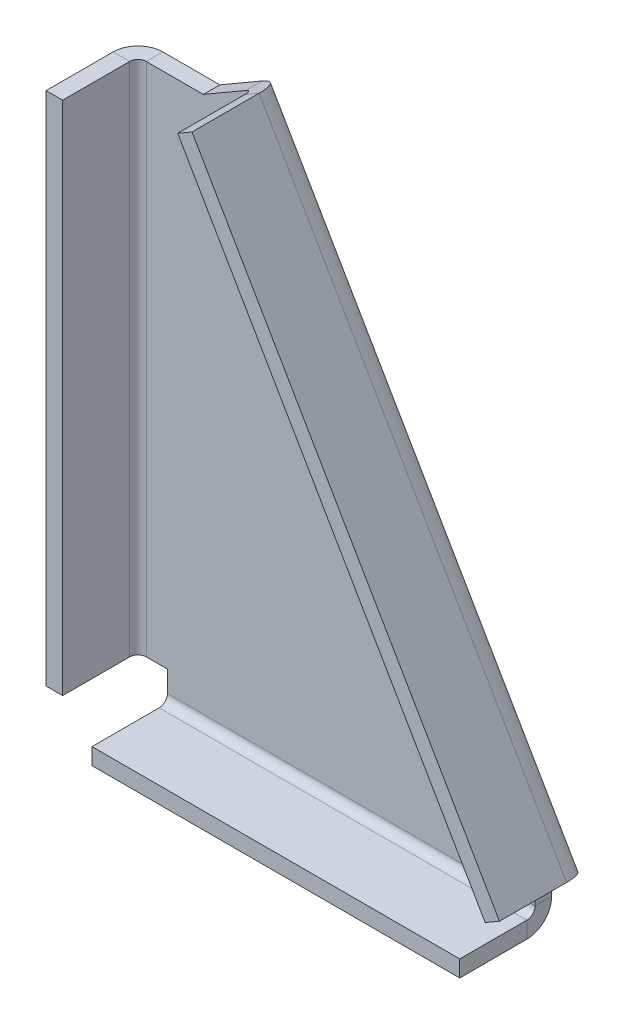
ISO-10303-21;
HEADER;
FILE_DESCRIPTION(('STEP AP214'),'2;1');
FILE_NAME('part.step','',(''),(''),'','','');
FILE_SCHEMA(('AUTOMOTIVE_DESIGN { 1 0 10303 214 1 1 1 1 }'));
ENDSEC;
DATA;
#1=APPLICATION_CONTEXT('core data for automotive mechanical design processes');
#2=APPLICATION_PROTOCOL_DEFINITION('international standard','automotive_design',2000,#1);
#3=PRODUCT_CONTEXT('',#1,'mechanical');
#4=PRODUCT('Part','Part','',(#3));
#5=PRODUCT_RELATED_PRODUCT_CATEGORY('part','',(#4));
#6=PRODUCT_DEFINITION_FORMATION('','',#4);
#7=PRODUCT_DEFINITION_CONTEXT('part definition',#1,'design');
#8=PRODUCT_DEFINITION('design','',#6,#7);
#9=PRODUCT_DEFINITION_SHAPE('','',#8);
#10=(LENGTH_UNIT() NAMED_UNIT(*) SI_UNIT(.MILLI.,.METRE.));
#11=(NAMED_UNIT(*) PLANE_ANGLE_UNIT() SI_UNIT($,.RADIAN.));
#12=(NAMED_UNIT(*) SI_UNIT($,.STERADIAN.) SOLID_ANGLE_UNIT());
#13=UNCERTAINTY_MEASURE_WITH_UNIT(LENGTH_MEASURE(1.E-05),#10,'distance_accuracy_value','');
#14=(GEOMETRIC_REPRESENTATION_CONTEXT(3) GLOBAL_UNCERTAINTY_ASSIGNED_CONTEXT((#13)) GLOBAL_UNIT_ASSIGNED_CONTEXT((#10,
#11,#12)) REPRESENTATION_CONTEXT('',''));
#15=CARTESIAN_POINT('',(0.,0.,0.));
#16=DIRECTION('',(0.,0.,1.));
#17=DIRECTION('',(1.,0.,0.));
#18=AXIS2_PLACEMENT_3D('',#15,#16,#17);
#19=CARTESIAN_POINT('',(0.,0.,-2.286));
#20=DIRECTION('',(0.,0.,-1.));
#21=DIRECTION('',(-1.,0.,0.));
#22=AXIS2_PLACEMENT_3D('',#19,#20,#21);
#23=PLANE('',#22);
#24=DIRECTION('',(-0.864865697453777,-0.502003312108388,0.));
#25=VECTOR('',#24,1.);
#26=CARTESIAN_POINT('',(13.8111595230831,76.3747536964412,-2.286));
#27=LINE('',#26,#25);
#28=CARTESIAN_POINT('',(10.8455350465142,74.6533843392215,-2.28599999999996));
#29=VERTEX_POINT('',#28);
#30=CARTESIAN_POINT('',(4.96439556786529,71.2397312067814,-2.286));
#31=VERTEX_POINT('',#30);
#32=EDGE_CURVE('E126',#29,#31,#27,.T.);
#33=ORIENTED_EDGE('',*,*,#32,.F.);
#34=DIRECTION('',(-0.502003312108388,0.864865697453777,0.));
#35=VECTOR('',#34,1.);
#36=CARTESIAN_POINT('',(10.8455350465142,74.6533843392216,-2.28599999999996));
#37=LINE('',#36,#35);
#38=CARTESIAN_POINT('',(53.326272702263,1.46635167466894,-2.286));
#39=VERTEX_POINT('',#38);
#40=EDGE_CURVE('E299',#29,#39,#37,.F.);
#41=ORIENTED_EDGE('',*,*,#40,.T.);
#42=DIRECTION('',(0.864865697453778,0.502003312108387,0.));
#43=VECTOR('',#42,1.);
#44=CARTESIAN_POINT('',(50.8,0.,-2.286));
#45=LINE('',#44,#43);
#46=CARTESIAN_POINT('',(50.8,0.,-2.286));
#47=VERTEX_POINT('',#46);
#48=EDGE_CURVE('E431',#47,#39,#45,.T.);
#49=ORIENTED_EDGE('',*,*,#48,.F.);
#50=DIRECTION('',(0.,1.,0.));
#51=VECTOR('',#50,1.);
#52=CARTESIAN_POINT('',(50.8,-6.35,-2.286));
#53=LINE('',#52,#51);
#54=CARTESIAN_POINT('',(50.8,-2.921,-2.286));
#55=VERTEX_POINT('',#54);
#56=EDGE_CURVE('E429',#55,#47,#53,.T.);
#57=ORIENTED_EDGE('',*,*,#56,.F.);
#58=DIRECTION('',(1.,0.,0.));
#59=VECTOR('',#58,1.);
#60=CARTESIAN_POINT('',(50.8,-2.921,-2.286));
#61=LINE('',#60,#59);
#62=CARTESIAN_POINT('',(0.,-2.92099999999999,-2.286));
#63=VERTEX_POINT('',#62);
#64=EDGE_CURVE('E352',#55,#63,#61,.F.);
#65=ORIENTED_EDGE('',*,*,#64,.T.);
#66=DIRECTION('',(0.,-1.,0.));
#67=VECTOR('',#66,1.);
#68=CARTESIAN_POINT('',(0.,0.,-2.286));
#69=LINE('',#68,#67);
#70=CARTESIAN_POINT('',(0.,0.,-2.286));
#71=VERTEX_POINT('',#70);
#72=EDGE_CURVE('E425',#71,#63,#69,.T.);
#73=ORIENTED_EDGE('',*,*,#72,.F.);
#74=DIRECTION('',(1.,0.,0.));
#75=VECTOR('',#74,1.);
#76=CARTESIAN_POINT('',(-6.35,0.,-2.286));
#77=LINE('',#76,#75);
#78=CARTESIAN_POINT('',(-2.92100000000002,0.,-2.28599999999999));
#79=VERTEX_POINT('',#78);
#80=EDGE_CURVE('E151',#79,#71,#77,.T.);
#81=ORIENTED_EDGE('',*,*,#80,.F.);
#82=DIRECTION('',(0.,-1.,0.));
#83=VECTOR('',#82,1.);
#84=CARTESIAN_POINT('',(-2.92100000000002,0.,-2.28599999999999));
#85=LINE('',#84,#83);
#86=CARTESIAN_POINT('',(-2.92100000000003,71.2397312067814,-2.286));
#87=VERTEX_POINT('',#86);
#88=EDGE_CURVE('E405',#79,#87,#85,.F.);
#89=ORIENTED_EDGE('',*,*,#88,.T.);
#90=DIRECTION('',(-1.,0.,0.));
#91=VECTOR('',#90,1.);
#92=CARTESIAN_POINT('',(4.96439556786529,71.2397312067814,-2.286));
#93=LINE('',#92,#91);
#94=EDGE_CURVE('E435',#31,#87,#93,.T.);
#95=ORIENTED_EDGE('',*,*,#94,.F.);
#96=EDGE_LOOP('',(#33,#41,#49,#57,#65,#73,#81,#89,#95));
#97=FACE_BOUND('',#96,.T.);
#98=ADVANCED_FACE('F101',(#97),#23,.T.);
#99=CARTESIAN_POINT('',(0.,0.,0.));
#100=DIRECTION('',(0.,0.,-1.));
#101=DIRECTION('',(-1.,0.,0.));
#102=AXIS2_PLACEMENT_3D('',#99,#100,#101);
#103=PLANE('',#102);
#104=DIRECTION('',(-0.502003312108388,0.864865697453777,0.));
#105=VECTOR('',#104,1.);
#106=CARTESIAN_POINT('',(10.8455350465141,74.6533843392216,0.));
#107=LINE('',#106,#105);
#108=CARTESIAN_POINT('',(10.8455350465142,74.6533843392215,0.));
#109=VERTEX_POINT('',#108);
#110=CARTESIAN_POINT('',(53.326272702263,1.46635167466892,0.));
#111=VERTEX_POINT('',#110);
#112=EDGE_CURVE('E312',#109,#111,#107,.F.);
#113=ORIENTED_EDGE('',*,*,#112,.F.);
#114=DIRECTION('',(-0.864865697453777,-0.502003312108388,0.));
#115=VECTOR('',#114,1.);
#116=CARTESIAN_POINT('',(13.8111595230831,76.3747536964412,0.));
#117=LINE('',#116,#115);
#118=CARTESIAN_POINT('',(4.96439556786529,71.2397312067814,0.));
#119=VERTEX_POINT('',#118);
#120=EDGE_CURVE('E145',#109,#119,#117,.T.);
#121=ORIENTED_EDGE('',*,*,#120,.T.);
#122=DIRECTION('',(-1.,0.,0.));
#123=VECTOR('',#122,1.);
#124=CARTESIAN_POINT('',(4.96439556786529,71.2397312067814,0.));
#125=LINE('',#124,#123);
#126=CARTESIAN_POINT('',(-2.92100000000003,71.2397312067814,0.));
#127=VERTEX_POINT('',#126);
#128=EDGE_CURVE('E426',#119,#127,#125,.T.);
#129=ORIENTED_EDGE('',*,*,#128,.T.);
#130=DIRECTION('',(0.,-1.,0.));
#131=VECTOR('',#130,1.);
#132=CARTESIAN_POINT('',(-2.921,0.,0.));
#133=LINE('',#132,#131);
#134=CARTESIAN_POINT('',(-2.921,0.,0.));
#135=VERTEX_POINT('',#134);
#136=EDGE_CURVE('E416',#135,#127,#133,.F.);
#137=ORIENTED_EDGE('',*,*,#136,.F.);
#138=DIRECTION('',(1.,0.,0.));
#139=VECTOR('',#138,1.);
#140=CARTESIAN_POINT('',(-6.35,0.,0.));
#141=LINE('',#140,#139);
#142=CARTESIAN_POINT('',(0.,0.,0.));
#143=VERTEX_POINT('',#142);
#144=EDGE_CURVE('E422',#135,#143,#141,.T.);
#145=ORIENTED_EDGE('',*,*,#144,.T.);
#146=DIRECTION('',(0.,-1.,0.));
#147=VECTOR('',#146,1.);
#148=CARTESIAN_POINT('',(0.,0.,0.));
#149=LINE('',#148,#147);
#150=CARTESIAN_POINT('',(0.,-2.921,0.));
#151=VERTEX_POINT('',#150);
#152=EDGE_CURVE('E439',#143,#151,#149,.T.);
#153=ORIENTED_EDGE('',*,*,#152,.T.);
#154=DIRECTION('',(1.,0.,0.));
#155=VECTOR('',#154,1.);
#156=CARTESIAN_POINT('',(50.8,-2.921,0.));
#157=LINE('',#156,#155);
#158=CARTESIAN_POINT('',(50.8,-2.921,0.));
#159=VERTEX_POINT('',#158);
#160=EDGE_CURVE('E365',#159,#151,#157,.F.);
#161=ORIENTED_EDGE('',*,*,#160,.F.);
#162=DIRECTION('',(0.,1.,0.));
#163=VECTOR('',#162,1.);
#164=CARTESIAN_POINT('',(50.8,-6.35,0.));
#165=LINE('',#164,#163);
#166=CARTESIAN_POINT('',(50.8,0.,0.));
#167=VERTEX_POINT('',#166);
#168=EDGE_CURVE('E442',#159,#167,#165,.T.);
#169=ORIENTED_EDGE('',*,*,#168,.T.);
#170=DIRECTION('',(0.864865697453778,0.502003312108387,0.));
#171=VECTOR('',#170,1.);
#172=CARTESIAN_POINT('',(50.8,0.,0.));
#173=LINE('',#172,#171);
#174=EDGE_CURVE('E444',#167,#111,#173,.T.);
#175=ORIENTED_EDGE('',*,*,#174,.T.);
#176=EDGE_LOOP('',(#113,#121,#129,#137,#145,#153,#161,#169,#175));
#177=FACE_BOUND('',#176,.T.);
#178=ADVANCED_FACE('F460',(#177),#103,.F.);
#179=CARTESIAN_POINT('',(13.8111595230831,76.3747536964412,-2.286));
#180=DIRECTION('',(-0.502003312108388,0.864865697453778,0.));
#181=DIRECTION('',(-0.864865697453778,-0.502003312108388,0.));
#182=AXIS2_PLACEMENT_3D('',#179,#180,#181);
#183=PLANE('',#182);
#184=ORIENTED_EDGE('',*,*,#120,.F.);
#185=DIRECTION('',(0.,0.,-1.));
#186=VECTOR('',#185,1.);
#187=CARTESIAN_POINT('',(10.8455350465142,74.6533843392215,0.));
#188=LINE('',#187,#186);
#189=EDGE_CURVE('E306',#109,#29,#188,.T.);
#190=ORIENTED_EDGE('',*,*,#189,.T.);
#191=ORIENTED_EDGE('',*,*,#32,.T.);
#192=DIRECTION('',(0.,0.,1.));
#193=VECTOR('',#192,1.);
#194=CARTESIAN_POINT('',(4.96439556786529,71.2397312067814,-2.286));
#195=LINE('',#194,#193);
#196=EDGE_CURVE('E13',#31,#119,#195,.T.);
#197=ORIENTED_EDGE('',*,*,#196,.T.);
#198=EDGE_LOOP('',(#184,#190,#191,#197));
#199=FACE_BOUND('',#198,.T.);
#200=ADVANCED_FACE('F508',(#199),#183,.T.);
#201=CARTESIAN_POINT('',(50.8,-6.35,-2.286));
#202=DIRECTION('',(1.,0.,0.));
#203=DIRECTION('',(0.,0.,-1.));
#204=AXIS2_PLACEMENT_3D('',#201,#202,#203);
#205=PLANE('',#204);
#206=ORIENTED_EDGE('',*,*,#168,.F.);
#207=DIRECTION('',(0.,0.,-1.));
#208=VECTOR('',#207,1.);
#209=CARTESIAN_POINT('',(50.8,-2.921,0.));
#210=LINE('',#209,#208);
#211=EDGE_CURVE('E359',#159,#55,#210,.T.);
#212=ORIENTED_EDGE('',*,*,#211,.T.);
#213=ORIENTED_EDGE('',*,*,#56,.T.);
#214=DIRECTION('',(0.,0.,1.));
#215=VECTOR('',#214,1.);
#216=CARTESIAN_POINT('',(50.8,0.,-2.286));
#217=LINE('',#216,#215);
#218=EDGE_CURVE('E110',#47,#167,#217,.T.);
#219=ORIENTED_EDGE('',*,*,#218,.T.);
#220=EDGE_LOOP('',(#206,#212,#213,#219));
#221=FACE_BOUND('',#220,.T.);
#222=ADVANCED_FACE('F520',(#221),#205,.T.);
#223=CARTESIAN_POINT('',(-6.35,0.,-2.286));
#224=DIRECTION('',(0.,-1.,0.));
#225=DIRECTION('',(0.,0.,-1.));
#226=AXIS2_PLACEMENT_3D('',#223,#224,#225);
#227=PLANE('',#226);
#228=ORIENTED_EDGE('',*,*,#144,.F.);
#229=DIRECTION('',(0.,0.,-1.));
#230=VECTOR('',#229,1.);
#231=CARTESIAN_POINT('',(-2.921,0.,0.));
#232=LINE('',#231,#230);
#233=EDGE_CURVE('E410',#135,#79,#232,.T.);
#234=ORIENTED_EDGE('',*,*,#233,.T.);
#235=ORIENTED_EDGE('',*,*,#80,.T.);
#236=DIRECTION('',(0.,0.,1.));
#237=VECTOR('',#236,1.);
#238=CARTESIAN_POINT('',(0.,0.,-2.286));
#239=LINE('',#238,#237);
#240=EDGE_CURVE('E105',#71,#143,#239,.T.);
#241=ORIENTED_EDGE('',*,*,#240,.T.);
#242=EDGE_LOOP('',(#228,#234,#235,#241));
#243=FACE_BOUND('',#242,.T.);
#244=ADVANCED_FACE('F103',(#243),#227,.T.);
#245=CARTESIAN_POINT('',(4.96439556786529,71.2397312067814,-2.286));
#246=DIRECTION('',(0.,1.,0.));
#247=DIRECTION('',(0.,0.,1.));
#248=AXIS2_PLACEMENT_3D('',#245,#246,#247);
#249=PLANE('',#248);
#250=DIRECTION('',(0.,0.,-1.));
#251=VECTOR('',#250,1.);
#252=CARTESIAN_POINT('',(-2.92100000000003,71.2397312067814,0.));
#253=LINE('',#252,#251);
#254=EDGE_CURVE('E420',#127,#87,#253,.T.);
#255=ORIENTED_EDGE('',*,*,#254,.F.);
#256=ORIENTED_EDGE('',*,*,#128,.F.);
#257=ORIENTED_EDGE('',*,*,#196,.F.);
#258=ORIENTED_EDGE('',*,*,#94,.T.);
#259=EDGE_LOOP('',(#255,#256,#257,#258));
#260=FACE_BOUND('',#259,.T.);
#261=ADVANCED_FACE('F513',(#260),#249,.T.);
#262=CARTESIAN_POINT('',(50.8,0.,-2.286));
#263=DIRECTION('',(0.502003312108387,-0.864865697453778,0.));
#264=DIRECTION('',(0.864865697453778,0.502003312108387,0.));
#265=AXIS2_PLACEMENT_3D('',#262,#263,#264);
#266=PLANE('',#265);
#267=DIRECTION('',(0.,0.,-1.));
#268=VECTOR('',#267,1.);
#269=CARTESIAN_POINT('',(53.326272702263,1.46635167466892,0.));
#270=LINE('',#269,#268);
#271=EDGE_CURVE('E317',#111,#39,#270,.T.);
#272=ORIENTED_EDGE('',*,*,#271,.F.);
#273=ORIENTED_EDGE('',*,*,#174,.F.);
#274=ORIENTED_EDGE('',*,*,#218,.F.);
#275=ORIENTED_EDGE('',*,*,#48,.T.);
#276=EDGE_LOOP('',(#272,#273,#274,#275));
#277=FACE_BOUND('',#276,.T.);
#278=ADVANCED_FACE('F516',(#277),#266,.T.);
#279=CARTESIAN_POINT('',(0.,0.,-2.286));
#280=DIRECTION('',(-1.,0.,0.));
#281=DIRECTION('',(0.,-1.,0.));
#282=AXIS2_PLACEMENT_3D('',#279,#280,#281);
#283=PLANE('',#282);
#284=DIRECTION('',(0.,0.,-1.));
#285=VECTOR('',#284,1.);
#286=CARTESIAN_POINT('',(0.,-2.921,0.));
#287=LINE('',#286,#285);
#288=EDGE_CURVE('E369',#151,#63,#287,.T.);
#289=ORIENTED_EDGE('',*,*,#288,.F.);
#290=ORIENTED_EDGE('',*,*,#152,.F.);
#291=ORIENTED_EDGE('',*,*,#240,.F.);
#292=ORIENTED_EDGE('',*,*,#72,.T.);
#293=EDGE_LOOP('',(#289,#290,#291,#292));
#294=FACE_BOUND('',#293,.T.);
#295=ADVANCED_FACE('F458',(#294),#283,.T.);
#296=CARTESIAN_POINT('',(-2.92100000000002,71.2397312067814,1.143));
#297=DIRECTION('',(0.,1.,0.));
#298=DIRECTION('',(-1.,0.,0.));
#299=AXIS2_PLACEMENT_3D('',#296,#297,#298);
#300=PLANE('',#299);
#301=DIRECTION('',(1.,0.,0.));
#302=VECTOR('',#301,1.);
#303=CARTESIAN_POINT('',(-6.35000000000001,71.2397312067814,1.14299999999999));
#304=LINE('',#303,#302);
#305=CARTESIAN_POINT('',(-4.06400000000001,71.2397312067814,1.143));
#306=VERTEX_POINT('',#305);
#307=CARTESIAN_POINT('',(-6.35000000000001,71.2397312067814,1.14299999999999));
#308=VERTEX_POINT('',#307);
#309=EDGE_CURVE('E372',#306,#308,#304,.F.);
#310=ORIENTED_EDGE('',*,*,#309,.F.);
#311=CARTESIAN_POINT('',(-2.92100000000002,71.2397312067814,1.143));
#312=DIRECTION('',(0.,-1.,0.));
#313=DIRECTION('',(1.,0.,0.));
#314=AXIS2_PLACEMENT_3D('',#311,#312,#313);
#315=CIRCLE('',#314,1.14299999999999);
#316=EDGE_CURVE('E413',#127,#306,#315,.F.);
#317=ORIENTED_EDGE('',*,*,#316,.F.);
#318=ORIENTED_EDGE('',*,*,#254,.T.);
#319=CARTESIAN_POINT('',(-2.92100000000002,71.2397312067814,1.143));
#320=DIRECTION('',(0.,-1.,0.));
#321=DIRECTION('',(1.,0.,0.));
#322=AXIS2_PLACEMENT_3D('',#319,#320,#321);
#323=CIRCLE('',#322,3.42899999999999);
#324=EDGE_CURVE('E118',#87,#308,#323,.F.);
#325=ORIENTED_EDGE('',*,*,#324,.T.);
#326=EDGE_LOOP('',(#310,#317,#318,#325));
#327=FACE_BOUND('',#326,.T.);
#328=ADVANCED_FACE('F470',(#327),#300,.T.);
#329=CARTESIAN_POINT('',(-2.92099999999999,0.,1.143));
#330=DIRECTION('',(0.,1.,0.));
#331=DIRECTION('',(-1.,0.,0.));
#332=AXIS2_PLACEMENT_3D('',#329,#330,#331);
#333=PLANE('',#332);
#334=CARTESIAN_POINT('',(-2.92099999999999,0.,1.143));
#335=DIRECTION('',(0.,-1.,0.));
#336=DIRECTION('',(1.,0.,0.));
#337=AXIS2_PLACEMENT_3D('',#334,#335,#336);
#338=CIRCLE('',#337,1.14299999999999);
#339=CARTESIAN_POINT('',(-4.06399999999998,0.,1.143));
#340=VERTEX_POINT('',#339);
#341=EDGE_CURVE('E378',#340,#135,#338,.T.);
#342=ORIENTED_EDGE('',*,*,#341,.F.);
#343=DIRECTION('',(1.,0.,0.));
#344=VECTOR('',#343,1.);
#345=CARTESIAN_POINT('',(-4.064,0.,1.143));
#346=LINE('',#345,#344);
#347=CARTESIAN_POINT('',(-6.35,0.,1.14299999999999));
#348=VERTEX_POINT('',#347);
#349=EDGE_CURVE('E398',#340,#348,#346,.F.);
#350=ORIENTED_EDGE('',*,*,#349,.T.);
#351=CARTESIAN_POINT('',(-2.92099999999999,0.,1.143));
#352=DIRECTION('',(0.,-1.,0.));
#353=DIRECTION('',(1.,0.,0.));
#354=AXIS2_PLACEMENT_3D('',#351,#352,#353);
#355=CIRCLE('',#354,3.42899999999999);
#356=EDGE_CURVE('E408',#348,#79,#355,.T.);
#357=ORIENTED_EDGE('',*,*,#356,.T.);
#358=ORIENTED_EDGE('',*,*,#233,.F.);
#359=EDGE_LOOP('',(#342,#350,#357,#358));
#360=FACE_BOUND('',#359,.T.);
#361=ADVANCED_FACE('F490',(#360),#333,.F.);
#362=CARTESIAN_POINT('',(-2.92099999999999,0.,1.143));
#363=DIRECTION('',(0.,-1.,0.));
#364=DIRECTION('',(-1.,0.,0.));
#365=AXIS2_PLACEMENT_3D('',#362,#363,#364);
#366=CYLINDRICAL_SURFACE('',#365,3.42899999999999);
#367=ORIENTED_EDGE('',*,*,#88,.F.);
#368=ORIENTED_EDGE('',*,*,#356,.F.);
#369=DIRECTION('',(0.,-1.,0.));
#370=VECTOR('',#369,1.);
#371=CARTESIAN_POINT('',(-6.35000000000001,71.2397312067814,1.14299999999999));
#372=LINE('',#371,#370);
#373=EDGE_CURVE('E396',#348,#308,#372,.F.);
#374=ORIENTED_EDGE('',*,*,#373,.T.);
#375=ORIENTED_EDGE('',*,*,#324,.F.);
#376=EDGE_LOOP('',(#367,#368,#374,#375));
#377=FACE_BOUND('',#376,.T.);
#378=ADVANCED_FACE('F532',(#377),#366,.T.);
#379=CARTESIAN_POINT('',(-2.92099999999999,0.,1.143));
#380=DIRECTION('',(0.,-1.,0.));
#381=DIRECTION('',(-1.,0.,0.));
#382=AXIS2_PLACEMENT_3D('',#379,#380,#381);
#383=CYLINDRICAL_SURFACE('',#382,1.14299999999999);
#384=ORIENTED_EDGE('',*,*,#136,.T.);
#385=ORIENTED_EDGE('',*,*,#316,.T.);
#386=DIRECTION('',(0.,-1.,0.));
#387=VECTOR('',#386,1.);
#388=CARTESIAN_POINT('',(-4.06400000000001,71.2397312067814,1.143));
#389=LINE('',#388,#387);
#390=EDGE_CURVE('E401',#306,#340,#389,.T.);
#391=ORIENTED_EDGE('',*,*,#390,.T.);
#392=ORIENTED_EDGE('',*,*,#341,.T.);
#393=EDGE_LOOP('',(#384,#385,#391,#392));
#394=FACE_BOUND('',#393,.T.);
#395=ADVANCED_FACE('F466',(#394),#383,.F.);
#396=CARTESIAN_POINT('',(-6.35000000000001,71.2397312067814,0.));
#397=DIRECTION('',(0.,-1.,0.));
#398=DIRECTION('',(1.,0.,0.));
#399=AXIS2_PLACEMENT_3D('',#396,#397,#398);
#400=PLANE('',#399);
#401=ORIENTED_EDGE('',*,*,#309,.T.);
#402=DIRECTION('',(0.,0.,-1.));
#403=VECTOR('',#402,1.);
#404=CARTESIAN_POINT('',(-6.35000000000001,71.2397312067814,0.));
#405=LINE('',#404,#403);
#406=CARTESIAN_POINT('',(-6.35000000000004,71.2397312067814,10.414));
#407=VERTEX_POINT('',#406);
#408=EDGE_CURVE('E386',#407,#308,#405,.T.);
#409=ORIENTED_EDGE('',*,*,#408,.F.);
#410=DIRECTION('',(1.,0.,0.));
#411=VECTOR('',#410,1.);
#412=CARTESIAN_POINT('',(-6.35000000000004,71.2397312067814,10.414));
#413=LINE('',#412,#411);
#414=CARTESIAN_POINT('',(-4.06400000000005,71.2397312067814,10.414));
#415=VERTEX_POINT('',#414);
#416=EDGE_CURVE('E379',#407,#415,#413,.T.);
#417=ORIENTED_EDGE('',*,*,#416,.T.);
#418=DIRECTION('',(0.,0.,1.));
#419=VECTOR('',#418,1.);
#420=CARTESIAN_POINT('',(-4.06400000000001,71.2397312067814,0.));
#421=LINE('',#420,#419);
#422=EDGE_CURVE('E393',#415,#306,#421,.F.);
#423=ORIENTED_EDGE('',*,*,#422,.T.);
#424=EDGE_LOOP('',(#401,#409,#417,#423));
#425=FACE_BOUND('',#424,.T.);
#426=ADVANCED_FACE('F473',(#425),#400,.F.);
#427=CARTESIAN_POINT('',(-6.35000000000004,0.,10.414));
#428=DIRECTION('',(0.,1.,0.));
#429=DIRECTION('',(-1.,0.,0.));
#430=AXIS2_PLACEMENT_3D('',#427,#428,#429);
#431=PLANE('',#430);
#432=ORIENTED_EDGE('',*,*,#349,.F.);
#433=DIRECTION('',(0.,0.,-1.));
#434=VECTOR('',#433,1.);
#435=CARTESIAN_POINT('',(-4.06400000000004,0.,10.414));
#436=LINE('',#435,#434);
#437=CARTESIAN_POINT('',(-4.06400000000004,0.,10.414));
#438=VERTEX_POINT('',#437);
#439=EDGE_CURVE('E391',#340,#438,#436,.F.);
#440=ORIENTED_EDGE('',*,*,#439,.T.);
#441=DIRECTION('',(1.,0.,0.));
#442=VECTOR('',#441,1.);
#443=CARTESIAN_POINT('',(-6.35000000000004,0.,10.414));
#444=LINE('',#443,#442);
#445=CARTESIAN_POINT('',(-6.35000000000004,0.,10.414));
#446=VERTEX_POINT('',#445);
#447=EDGE_CURVE('E375',#446,#438,#444,.T.);
#448=ORIENTED_EDGE('',*,*,#447,.F.);
#449=DIRECTION('',(0.,0.,1.));
#450=VECTOR('',#449,1.);
#451=CARTESIAN_POINT('',(-6.35,0.,0.));
#452=LINE('',#451,#450);
#453=EDGE_CURVE('E384',#348,#446,#452,.T.);
#454=ORIENTED_EDGE('',*,*,#453,.F.);
#455=EDGE_LOOP('',(#432,#440,#448,#454));
#456=FACE_BOUND('',#455,.T.);
#457=ADVANCED_FACE('F492',(#456),#431,.F.);
#458=CARTESIAN_POINT('',(-6.35,0.,0.));
#459=DIRECTION('',(1.,0.,0.));
#460=DIRECTION('',(0.,0.,-1.));
#461=AXIS2_PLACEMENT_3D('',#458,#459,#460);
#462=PLANE('',#461);
#463=ORIENTED_EDGE('',*,*,#373,.F.);
#464=ORIENTED_EDGE('',*,*,#453,.T.);
#465=DIRECTION('',(0.,1.,0.));
#466=VECTOR('',#465,1.);
#467=CARTESIAN_POINT('',(-6.35000000000004,0.,10.414));
#468=LINE('',#467,#466);
#469=EDGE_CURVE('E382',#446,#407,#468,.T.);
#470=ORIENTED_EDGE('',*,*,#469,.T.);
#471=ORIENTED_EDGE('',*,*,#408,.T.);
#472=EDGE_LOOP('',(#463,#464,#470,#471));
#473=FACE_BOUND('',#472,.T.);
#474=ADVANCED_FACE('F477',(#473),#462,.F.);
#475=CARTESIAN_POINT('',(-4.064,0.,0.));
#476=DIRECTION('',(1.,0.,0.));
#477=DIRECTION('',(0.,0.,-1.));
#478=AXIS2_PLACEMENT_3D('',#475,#476,#477);
#479=PLANE('',#478);
#480=ORIENTED_EDGE('',*,*,#439,.F.);
#481=ORIENTED_EDGE('',*,*,#390,.F.);
#482=ORIENTED_EDGE('',*,*,#422,.F.);
#483=DIRECTION('',(0.,-1.,0.));
#484=VECTOR('',#483,1.);
#485=CARTESIAN_POINT('',(-4.06400000000005,71.2397312067814,10.414));
#486=LINE('',#485,#484);
#487=EDGE_CURVE('E389',#438,#415,#486,.F.);
#488=ORIENTED_EDGE('',*,*,#487,.F.);
#489=EDGE_LOOP('',(#480,#481,#482,#488));
#490=FACE_BOUND('',#489,.T.);
#491=ADVANCED_FACE('F487',(#490),#479,.T.);
#492=CARTESIAN_POINT('',(-6.35000000000004,71.2397312067814,10.414));
#493=DIRECTION('',(0.,0.,-1.));
#494=DIRECTION('',(-1.,0.,0.));
#495=AXIS2_PLACEMENT_3D('',#492,#493,#494);
#496=PLANE('',#495);
#497=ORIENTED_EDGE('',*,*,#487,.T.);
#498=ORIENTED_EDGE('',*,*,#416,.F.);
#499=ORIENTED_EDGE('',*,*,#469,.F.);
#500=ORIENTED_EDGE('',*,*,#447,.T.);
#501=EDGE_LOOP('',(#497,#498,#499,#500));
#502=FACE_BOUND('',#501,.T.);
#503=ADVANCED_FACE('F483',(#502),#496,.F.);
#504=CARTESIAN_POINT('',(0.,-2.921,1.143));
#505=DIRECTION('',(-1.,0.,0.));
#506=DIRECTION('',(0.,0.,1.));
#507=AXIS2_PLACEMENT_3D('',#504,#505,#506);
#508=PLANE('',#507);
#509=DIRECTION('',(0.,1.,0.));
#510=VECTOR('',#509,1.);
#511=CARTESIAN_POINT('',(0.,-6.35,1.14299999999999));
#512=LINE('',#511,#510);
#513=CARTESIAN_POINT('',(0.,-4.064,1.143));
#514=VERTEX_POINT('',#513);
#515=CARTESIAN_POINT('',(0.,-6.35,1.14299999999999));
#516=VERTEX_POINT('',#515);
#517=EDGE_CURVE('E320',#514,#516,#512,.F.);
#518=ORIENTED_EDGE('',*,*,#517,.F.);
#519=CARTESIAN_POINT('',(0.,-2.921,1.143));
#520=DIRECTION('',(1.,0.,0.));
#521=DIRECTION('',(0.,0.,-1.));
#522=AXIS2_PLACEMENT_3D('',#519,#520,#521);
#523=CIRCLE('',#522,1.143);
#524=EDGE_CURVE('E362',#151,#514,#523,.F.);
#525=ORIENTED_EDGE('',*,*,#524,.F.);
#526=ORIENTED_EDGE('',*,*,#288,.T.);
#527=CARTESIAN_POINT('',(0.,-2.921,1.143));
#528=DIRECTION('',(1.,0.,0.));
#529=DIRECTION('',(0.,0.,-1.));
#530=AXIS2_PLACEMENT_3D('',#527,#528,#529);
#531=CIRCLE('',#530,3.429);
#532=EDGE_CURVE('E355',#63,#516,#531,.F.);
#533=ORIENTED_EDGE('',*,*,#532,.T.);
#534=EDGE_LOOP('',(#518,#525,#526,#533));
#535=FACE_BOUND('',#534,.T.);
#536=ADVANCED_FACE('F607',(#535),#508,.T.);
#537=CARTESIAN_POINT('',(50.8,-2.921,1.143));
#538=DIRECTION('',(-1.,0.,0.));
#539=DIRECTION('',(0.,0.,1.));
#540=AXIS2_PLACEMENT_3D('',#537,#538,#539);
#541=PLANE('',#540);
#542=CARTESIAN_POINT('',(50.8,-2.921,1.143));
#543=DIRECTION('',(1.,0.,0.));
#544=DIRECTION('',(0.,0.,-1.));
#545=AXIS2_PLACEMENT_3D('',#542,#543,#544);
#546=CIRCLE('',#545,1.143);
#547=CARTESIAN_POINT('',(50.8,-4.064,1.14299999999999));
#548=VERTEX_POINT('',#547);
#549=EDGE_CURVE('E325',#548,#159,#546,.T.);
#550=ORIENTED_EDGE('',*,*,#549,.F.);
#551=DIRECTION('',(0.,1.,0.));
#552=VECTOR('',#551,1.);
#553=CARTESIAN_POINT('',(50.8,-4.064,1.14299999999999));
#554=LINE('',#553,#552);
#555=CARTESIAN_POINT('',(50.8,-6.35,1.14299999999998));
#556=VERTEX_POINT('',#555);
#557=EDGE_CURVE('E345',#548,#556,#554,.F.);
#558=ORIENTED_EDGE('',*,*,#557,.T.);
#559=CARTESIAN_POINT('',(50.8,-2.921,1.143));
#560=DIRECTION('',(1.,0.,0.));
#561=DIRECTION('',(0.,0.,-1.));
#562=AXIS2_PLACEMENT_3D('',#559,#560,#561);
#563=CIRCLE('',#562,3.429);
#564=EDGE_CURVE('E356',#556,#55,#563,.T.);
#565=ORIENTED_EDGE('',*,*,#564,.T.);
#566=ORIENTED_EDGE('',*,*,#211,.F.);
#567=EDGE_LOOP('',(#550,#558,#565,#566));
#568=FACE_BOUND('',#567,.T.);
#569=ADVANCED_FACE('F546',(#568),#541,.F.);
#570=CARTESIAN_POINT('',(50.8,-2.921,1.143));
#571=DIRECTION('',(1.,0.,0.));
#572=DIRECTION('',(0.,-1.,0.));
#573=AXIS2_PLACEMENT_3D('',#570,#571,#572);
#574=CYLINDRICAL_SURFACE('',#573,3.429);
#575=ORIENTED_EDGE('',*,*,#64,.F.);
#576=ORIENTED_EDGE('',*,*,#564,.F.);
#577=DIRECTION('',(1.,0.,0.));
#578=VECTOR('',#577,1.);
#579=CARTESIAN_POINT('',(0.,-6.35,1.14299999999999));
#580=LINE('',#579,#578);
#581=EDGE_CURVE('E343',#556,#516,#580,.F.);
#582=ORIENTED_EDGE('',*,*,#581,.T.);
#583=ORIENTED_EDGE('',*,*,#532,.F.);
#584=EDGE_LOOP('',(#575,#576,#582,#583));
#585=FACE_BOUND('',#584,.T.);
#586=ADVANCED_FACE('F543',(#585),#574,.T.);
#587=CARTESIAN_POINT('',(50.8,-2.921,1.143));
#588=DIRECTION('',(1.,0.,0.));
#589=DIRECTION('',(0.,-1.,0.));
#590=AXIS2_PLACEMENT_3D('',#587,#588,#589);
#591=CYLINDRICAL_SURFACE('',#590,1.143);
#592=ORIENTED_EDGE('',*,*,#160,.T.);
#593=ORIENTED_EDGE('',*,*,#524,.T.);
#594=DIRECTION('',(1.,0.,0.));
#595=VECTOR('',#594,1.);
#596=CARTESIAN_POINT('',(0.,-4.064,1.143));
#597=LINE('',#596,#595);
#598=EDGE_CURVE('E348',#514,#548,#597,.T.);
#599=ORIENTED_EDGE('',*,*,#598,.T.);
#600=ORIENTED_EDGE('',*,*,#549,.T.);
#601=EDGE_LOOP('',(#592,#593,#599,#600));
#602=FACE_BOUND('',#601,.T.);
#603=ADVANCED_FACE('F600',(#602),#591,.F.);
#604=CARTESIAN_POINT('',(0.,-6.35,0.));
#605=DIRECTION('',(1.,0.,0.));
#606=DIRECTION('',(0.,0.,-1.));
#607=AXIS2_PLACEMENT_3D('',#604,#605,#606);
#608=PLANE('',#607);
#609=ORIENTED_EDGE('',*,*,#517,.T.);
#610=DIRECTION('',(0.,0.,-1.));
#611=VECTOR('',#610,1.);
#612=CARTESIAN_POINT('',(0.,-6.35,0.));
#613=LINE('',#612,#611);
#614=CARTESIAN_POINT('',(0.,-6.35000000000004,10.414));
#615=VERTEX_POINT('',#614);
#616=EDGE_CURVE('E333',#615,#516,#613,.T.);
#617=ORIENTED_EDGE('',*,*,#616,.F.);
#618=DIRECTION('',(0.,1.,0.));
#619=VECTOR('',#618,1.);
#620=CARTESIAN_POINT('',(0.,-6.35000000000004,10.414));
#621=LINE('',#620,#619);
#622=CARTESIAN_POINT('',(0.,-4.06400000000004,10.414));
#623=VERTEX_POINT('',#622);
#624=EDGE_CURVE('E326',#615,#623,#621,.T.);
#625=ORIENTED_EDGE('',*,*,#624,.T.);
#626=DIRECTION('',(0.,0.,1.));
#627=VECTOR('',#626,1.);
#628=CARTESIAN_POINT('',(0.,-4.064,0.));
#629=LINE('',#628,#627);
#630=EDGE_CURVE('E340',#623,#514,#629,.F.);
#631=ORIENTED_EDGE('',*,*,#630,.T.);
#632=EDGE_LOOP('',(#609,#617,#625,#631));
#633=FACE_BOUND('',#632,.T.);
#634=ADVANCED_FACE('F596',(#633),#608,.F.);
#635=CARTESIAN_POINT('',(50.8,-6.35000000000004,10.414));
#636=DIRECTION('',(-1.,0.,0.));
#637=DIRECTION('',(0.,0.,1.));
#638=AXIS2_PLACEMENT_3D('',#635,#636,#637);
#639=PLANE('',#638);
#640=ORIENTED_EDGE('',*,*,#557,.F.);
#641=DIRECTION('',(0.,0.,-1.));
#642=VECTOR('',#641,1.);
#643=CARTESIAN_POINT('',(50.8,-4.06400000000004,10.414));
#644=LINE('',#643,#642);
#645=CARTESIAN_POINT('',(50.8,-4.06400000000004,10.414));
#646=VERTEX_POINT('',#645);
#647=EDGE_CURVE('E338',#548,#646,#644,.F.);
#648=ORIENTED_EDGE('',*,*,#647,.T.);
#649=DIRECTION('',(0.,1.,0.));
#650=VECTOR('',#649,1.);
#651=CARTESIAN_POINT('',(50.8,-6.35000000000004,10.414));
#652=LINE('',#651,#650);
#653=CARTESIAN_POINT('',(50.8,-6.35000000000004,10.414));
#654=VERTEX_POINT('',#653);
#655=EDGE_CURVE('E322',#654,#646,#652,.T.);
#656=ORIENTED_EDGE('',*,*,#655,.F.);
#657=DIRECTION('',(0.,0.,1.));
#658=VECTOR('',#657,1.);
#659=CARTESIAN_POINT('',(50.8,-6.35,0.));
#660=LINE('',#659,#658);
#661=EDGE_CURVE('E331',#556,#654,#660,.T.);
#662=ORIENTED_EDGE('',*,*,#661,.F.);
#663=EDGE_LOOP('',(#640,#648,#656,#662));
#664=FACE_BOUND('',#663,.T.);
#665=ADVANCED_FACE('F586',(#664),#639,.F.);
#666=CARTESIAN_POINT('',(0.,-6.35,0.));
#667=DIRECTION('',(0.,1.,0.));
#668=DIRECTION('',(0.,0.,1.));
#669=AXIS2_PLACEMENT_3D('',#666,#667,#668);
#670=PLANE('',#669);
#671=ORIENTED_EDGE('',*,*,#581,.F.);
#672=ORIENTED_EDGE('',*,*,#661,.T.);
#673=DIRECTION('',(-1.,0.,0.));
#674=VECTOR('',#673,1.);
#675=CARTESIAN_POINT('',(0.,-6.35000000000004,10.414));
#676=LINE('',#675,#674);
#677=EDGE_CURVE('E329',#654,#615,#676,.T.);
#678=ORIENTED_EDGE('',*,*,#677,.T.);
#679=ORIENTED_EDGE('',*,*,#616,.T.);
#680=EDGE_LOOP('',(#671,#672,#678,#679));
#681=FACE_BOUND('',#680,.T.);
#682=ADVANCED_FACE('F582',(#681),#670,.F.);
#683=CARTESIAN_POINT('',(0.,-4.064,0.));
#684=DIRECTION('',(0.,1.,0.));
#685=DIRECTION('',(0.,0.,1.));
#686=AXIS2_PLACEMENT_3D('',#683,#684,#685);
#687=PLANE('',#686);
#688=ORIENTED_EDGE('',*,*,#647,.F.);
#689=ORIENTED_EDGE('',*,*,#598,.F.);
#690=ORIENTED_EDGE('',*,*,#630,.F.);
#691=DIRECTION('',(1.,0.,0.));
#692=VECTOR('',#691,1.);
#693=CARTESIAN_POINT('',(0.,-4.06400000000004,10.414));
#694=LINE('',#693,#692);
#695=EDGE_CURVE('E336',#646,#623,#694,.F.);
#696=ORIENTED_EDGE('',*,*,#695,.F.);
#697=EDGE_LOOP('',(#688,#689,#690,#696));
#698=FACE_BOUND('',#697,.T.);
#699=ADVANCED_FACE('F585',(#698),#687,.T.);
#700=CARTESIAN_POINT('',(0.,-6.35000000000004,10.414));
#701=DIRECTION('',(0.,0.,-1.));
#702=DIRECTION('',(0.,1.,0.));
#703=AXIS2_PLACEMENT_3D('',#700,#701,#702);
#704=PLANE('',#703);
#705=ORIENTED_EDGE('',*,*,#695,.T.);
#706=ORIENTED_EDGE('',*,*,#624,.F.);
#707=ORIENTED_EDGE('',*,*,#677,.F.);
#708=ORIENTED_EDGE('',*,*,#655,.T.);
#709=EDGE_LOOP('',(#705,#706,#707,#708));
#710=FACE_BOUND('',#709,.T.);
#711=ADVANCED_FACE('F580',(#710),#704,.F.);
#712=CARTESIAN_POINT('',(53.326272702263,1.46635167466891,1.14300000000001));
#713=DIRECTION('',(0.502003312108388,-0.864865697453777,0.));
#714=DIRECTION('',(0.864865697453777,0.502003312108388,0.));
#715=AXIS2_PLACEMENT_3D('',#712,#713,#714);
#716=PLANE('',#715);
#717=DIRECTION('',(-0.864865697453778,-0.502003312108387,0.));
#718=VECTOR('',#717,1.);
#719=CARTESIAN_POINT('',(56.291897178832,3.18772103188853,1.143));
#720=LINE('',#719,#718);
#721=CARTESIAN_POINT('',(54.3148141944527,2.04014146040878,1.143));
#722=VERTEX_POINT('',#721);
#723=CARTESIAN_POINT('',(56.291897178832,3.18772103188854,1.143));
#724=VERTEX_POINT('',#723);
#725=EDGE_CURVE('E282',#722,#724,#720,.F.);
#726=ORIENTED_EDGE('',*,*,#725,.F.);
#727=CARTESIAN_POINT('',(53.326272702263,1.46635167466891,1.14300000000001));
#728=DIRECTION('',(-0.502003312108388,0.864865697453777,0.));
#729=DIRECTION('',(-0.864865697453777,-0.502003312108388,0.));
#730=AXIS2_PLACEMENT_3D('',#727,#728,#729);
#731=CIRCLE('',#730,1.14299999999996);
#732=EDGE_CURVE('E309',#111,#722,#731,.F.);
#733=ORIENTED_EDGE('',*,*,#732,.F.);
#734=ORIENTED_EDGE('',*,*,#271,.T.);
#735=CARTESIAN_POINT('',(53.326272702263,1.46635167466888,1.14300000000001));
#736=DIRECTION('',(-0.502003312108388,0.864865697453777,0.));
#737=DIRECTION('',(-0.864865697453777,-0.502003312108388,0.));
#738=AXIS2_PLACEMENT_3D('',#735,#736,#737);
#739=CIRCLE('',#738,3.42899999999996);
#740=EDGE_CURVE('E302',#39,#724,#739,.F.);
#741=ORIENTED_EDGE('',*,*,#740,.T.);
#742=EDGE_LOOP('',(#726,#733,#734,#741));
#743=FACE_BOUND('',#742,.T.);
#744=ADVANCED_FACE('F552',(#743),#716,.T.);
#745=CARTESIAN_POINT('',(10.8455350465141,74.6533843392215,1.143));
#746=DIRECTION('',(0.502003312108388,-0.864865697453777,0.));
#747=DIRECTION('',(0.864865697453777,0.502003312108388,0.));
#748=AXIS2_PLACEMENT_3D('',#745,#746,#747);
#749=PLANE('',#748);
#750=CARTESIAN_POINT('',(10.8455350465141,74.6533843392215,1.143));
#751=DIRECTION('',(-0.502003312108388,0.864865697453777,0.));
#752=DIRECTION('',(-0.864865697453777,-0.502003312108388,0.));
#753=AXIS2_PLACEMENT_3D('',#750,#751,#752);
#754=CIRCLE('',#753,1.14299999999996);
#755=CARTESIAN_POINT('',(11.8340765387038,75.2271741249614,1.14299999999999));
#756=VERTEX_POINT('',#755);
#757=EDGE_CURVE('E314',#756,#109,#754,.T.);
#758=ORIENTED_EDGE('',*,*,#757,.F.);
#759=DIRECTION('',(-0.864865697453778,-0.502003312108387,0.));
#760=VECTOR('',#759,1.);
#761=CARTESIAN_POINT('',(11.8340765387038,75.2271741249614,1.14299999999999));
#762=LINE('',#761,#760);
#763=CARTESIAN_POINT('',(13.8111595230832,76.3747536964412,1.14299999999998));
#764=VERTEX_POINT('',#763);
#765=EDGE_CURVE('E293',#756,#764,#762,.F.);
#766=ORIENTED_EDGE('',*,*,#765,.T.);
#767=CARTESIAN_POINT('',(10.8455350465141,74.6533843392215,1.143));
#768=DIRECTION('',(-0.502003312108388,0.864865697453777,0.));
#769=DIRECTION('',(-0.864865697453777,-0.502003312108388,0.));
#770=AXIS2_PLACEMENT_3D('',#767,#768,#769);
#771=CIRCLE('',#770,3.42899999999996);
#772=EDGE_CURVE('E303',#764,#29,#771,.T.);
#773=ORIENTED_EDGE('',*,*,#772,.T.);
#774=ORIENTED_EDGE('',*,*,#189,.F.);
#775=EDGE_LOOP('',(#758,#766,#773,#774));
#776=FACE_BOUND('',#775,.T.);
#777=ADVANCED_FACE('F565',(#776),#749,.F.);
#778=CARTESIAN_POINT('',(10.8455350465141,74.6533843392216,1.143));
#779=DIRECTION('',(-0.502003312108388,0.864865697453777,0.));
#780=DIRECTION('',(0.864865697453777,0.502003312108388,0.));
#781=AXIS2_PLACEMENT_3D('',#778,#779,#780);
#782=CYLINDRICAL_SURFACE('',#781,3.42899999999996);
#783=ORIENTED_EDGE('',*,*,#40,.F.);
#784=ORIENTED_EDGE('',*,*,#772,.F.);
#785=DIRECTION('',(-0.502003312108387,0.864865697453778,0.));
#786=VECTOR('',#785,1.);
#787=CARTESIAN_POINT('',(56.291897178832,3.18772103188854,1.143));
#788=LINE('',#787,#786);
#789=EDGE_CURVE('E291',#764,#724,#788,.F.);
#790=ORIENTED_EDGE('',*,*,#789,.T.);
#791=ORIENTED_EDGE('',*,*,#740,.F.);
#792=EDGE_LOOP('',(#783,#784,#790,#791));
#793=FACE_BOUND('',#792,.T.);
#794=ADVANCED_FACE('F567',(#793),#782,.T.);
#795=CARTESIAN_POINT('',(10.8455350465141,74.6533843392216,1.143));
#796=DIRECTION('',(-0.502003312108388,0.864865697453777,0.));
#797=DIRECTION('',(0.864865697453777,0.502003312108388,0.));
#798=AXIS2_PLACEMENT_3D('',#795,#796,#797);
#799=CYLINDRICAL_SURFACE('',#798,1.14299999999996);
#800=ORIENTED_EDGE('',*,*,#112,.T.);
#801=ORIENTED_EDGE('',*,*,#732,.T.);
#802=DIRECTION('',(-0.502003312108387,0.864865697453778,0.));
#803=VECTOR('',#802,1.);
#804=CARTESIAN_POINT('',(54.3148141944526,2.04014146040877,1.14300000000001));
#805=LINE('',#804,#803);
#806=EDGE_CURVE('E296',#722,#756,#805,.T.);
#807=ORIENTED_EDGE('',*,*,#806,.T.);
#808=ORIENTED_EDGE('',*,*,#757,.T.);
#809=EDGE_LOOP('',(#800,#801,#807,#808));
#810=FACE_BOUND('',#809,.T.);
#811=ADVANCED_FACE('F555',(#810),#799,.F.);
#812=CARTESIAN_POINT('',(56.291897178832,3.18772103188853,0.));
#813=DIRECTION('',(-0.502003312108387,0.864865697453778,0.));
#814=DIRECTION('',(-0.864865697453778,-0.502003312108387,0.));
#815=AXIS2_PLACEMENT_3D('',#812,#813,#814);
#816=PLANE('',#815);
#817=ORIENTED_EDGE('',*,*,#725,.T.);
#818=DIRECTION('',(0.,0.,-1.));
#819=VECTOR('',#818,1.);
#820=CARTESIAN_POINT('',(56.291897178832,3.18772103188854,-1.63321660178035E-13));
#821=LINE('',#820,#819);
#822=CARTESIAN_POINT('',(56.291897178832,3.18772103188856,10.414));
#823=VERTEX_POINT('',#822);
#824=EDGE_CURVE('E263',#823,#724,#821,.T.);
#825=ORIENTED_EDGE('',*,*,#824,.F.);
#826=DIRECTION('',(-0.864865697453778,-0.502003312108387,0.));
#827=VECTOR('',#826,1.);
#828=CARTESIAN_POINT('',(56.291897178832,3.18772103188855,10.414));
#829=LINE('',#828,#827);
#830=CARTESIAN_POINT('',(54.3148141944527,2.04014146040879,10.414));
#831=VERTEX_POINT('',#830);
#832=EDGE_CURVE('E269',#823,#831,#829,.T.);
#833=ORIENTED_EDGE('',*,*,#832,.T.);
#834=DIRECTION('',(0.,0.,1.));
#835=VECTOR('',#834,1.);
#836=CARTESIAN_POINT('',(54.3148141944526,2.04014146040877,0.));
#837=LINE('',#836,#835);
#838=EDGE_CURVE('E289',#831,#722,#837,.F.);
#839=ORIENTED_EDGE('',*,*,#838,.T.);
#840=EDGE_LOOP('',(#817,#825,#833,#839));
#841=FACE_BOUND('',#840,.T.);
#842=ADVANCED_FACE('F281',(#841),#816,.F.);
#843=CARTESIAN_POINT('',(13.8111595230832,76.3747536964412,10.414));
#844=DIRECTION('',(0.502003312108387,-0.864865697453778,0.));
#845=DIRECTION('',(0.864865697453778,0.502003312108387,0.));
#846=AXIS2_PLACEMENT_3D('',#843,#844,#845);
#847=PLANE('',#846);
#848=ORIENTED_EDGE('',*,*,#765,.F.);
#849=DIRECTION('',(0.,0.,-1.));
#850=VECTOR('',#849,1.);
#851=CARTESIAN_POINT('',(11.8340765387039,75.2271741249614,10.414));
#852=LINE('',#851,#850);
#853=CARTESIAN_POINT('',(11.8340765387038,75.2271741249615,10.414));
#854=VERTEX_POINT('',#853);
#855=EDGE_CURVE('E285',#756,#854,#852,.F.);
#856=ORIENTED_EDGE('',*,*,#855,.T.);
#857=DIRECTION('',(-0.864865697453778,-0.502003312108387,0.));
#858=VECTOR('',#857,1.);
#859=CARTESIAN_POINT('',(13.8111595230832,76.3747536964412,10.414));
#860=LINE('',#859,#858);
#861=CARTESIAN_POINT('',(13.8111595230832,76.3747536964412,10.414));
#862=VERTEX_POINT('',#861);
#863=EDGE_CURVE('E278',#862,#854,#860,.T.);
#864=ORIENTED_EDGE('',*,*,#863,.F.);
#865=DIRECTION('',(0.,0.,1.));
#866=VECTOR('',#865,1.);
#867=CARTESIAN_POINT('',(13.8111595230832,76.3747536964412,-1.45091261763115E-13));
#868=LINE('',#867,#866);
#869=EDGE_CURVE('E265',#764,#862,#868,.T.);
#870=ORIENTED_EDGE('',*,*,#869,.F.);
#871=EDGE_LOOP('',(#848,#856,#864,#870));
#872=FACE_BOUND('',#871,.T.);
#873=ADVANCED_FACE('F562',(#872),#847,.F.);
#874=CARTESIAN_POINT('',(43.4899250501482,25.2433256201454,-1.6594098465607E-13));
#875=DIRECTION('',(-0.864865697453778,-0.502003312108387,0.));
#876=DIRECTION('',(0.502003312108387,-0.864865697453778,0.));
#877=AXIS2_PLACEMENT_3D('',#874,#875,#876);
#878=PLANE('',#877);
#879=ORIENTED_EDGE('',*,*,#789,.F.);
#880=ORIENTED_EDGE('',*,*,#869,.T.);
#881=DIRECTION('',(0.502003312108387,-0.864865697453778,0.));
#882=VECTOR('',#881,1.);
#883=CARTESIAN_POINT('',(43.4899250501482,25.2433256201455,10.414));
#884=LINE('',#883,#882);
#885=EDGE_CURVE('E258',#862,#823,#884,.T.);
#886=ORIENTED_EDGE('',*,*,#885,.T.);
#887=ORIENTED_EDGE('',*,*,#824,.T.);
#888=EDGE_LOOP('',(#879,#880,#886,#887));
#889=FACE_BOUND('',#888,.T.);
#890=ADVANCED_FACE('F261',(#889),#878,.F.);
#891=CARTESIAN_POINT('',(41.5128420657689,24.0957460486657,-1.57959458315475E-13));
#892=DIRECTION('',(-0.864865697453778,-0.502003312108387,0.));
#893=DIRECTION('',(0.502003312108387,-0.864865697453778,0.));
#894=AXIS2_PLACEMENT_3D('',#891,#892,#893);
#895=PLANE('',#894);
#896=ORIENTED_EDGE('',*,*,#855,.F.);
#897=ORIENTED_EDGE('',*,*,#806,.F.);
#898=ORIENTED_EDGE('',*,*,#838,.F.);
#899=DIRECTION('',(-0.502003312108387,0.864865697453778,0.));
#900=VECTOR('',#899,1.);
#901=CARTESIAN_POINT('',(54.3148141944527,2.04014146040879,10.414));
#902=LINE('',#901,#900);
#903=EDGE_CURVE('E274',#854,#831,#902,.F.);
#904=ORIENTED_EDGE('',*,*,#903,.F.);
#905=EDGE_LOOP('',(#896,#897,#898,#904));
#906=FACE_BOUND('',#905,.T.);
#907=ADVANCED_FACE('F559',(#906),#895,.T.);
#908=CARTESIAN_POINT('',(56.291897178832,3.18772103188855,10.414));
#909=DIRECTION('',(0.,0.,-1.));
#910=DIRECTION('',(-1.,0.,0.));
#911=AXIS2_PLACEMENT_3D('',#908,#909,#910);
#912=PLANE('',#911);
#913=ORIENTED_EDGE('',*,*,#903,.T.);
#914=ORIENTED_EDGE('',*,*,#832,.F.);
#915=ORIENTED_EDGE('',*,*,#885,.F.);
#916=ORIENTED_EDGE('',*,*,#863,.T.);
#917=EDGE_LOOP('',(#913,#914,#915,#916));
#918=FACE_BOUND('',#917,.T.);
#919=ADVANCED_FACE('F272',(#918),#912,.F.);
#920=CLOSED_SHELL('',(#98,#178,#200,#222,#244,#261,#278,#295,#328,#361,#378,#395,#426,#457,#474,
#491,#503,#536,#569,#586,#603,#634,#665,#682,#699,#711,#744,#777,#794,#811,#842,#873,#890,#907,#919));
#921=MANIFOLD_SOLID_BREP('B2',#920);
#922=ADVANCED_BREP_SHAPE_REPRESENTATION('',(#18,#921),#14);
#923=SHAPE_DEFINITION_REPRESENTATION(#9,#922);
ENDSEC;
END-ISO-10303-21;
